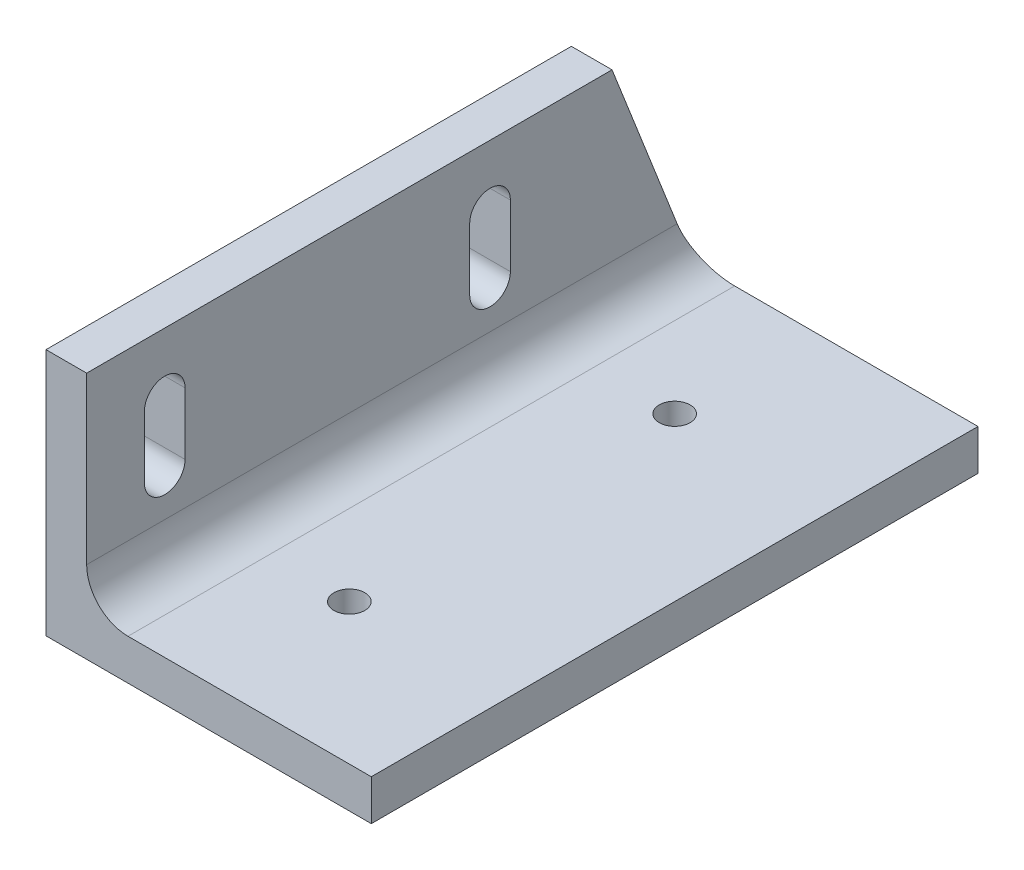
ISO-10303-21;
HEADER;
FILE_DESCRIPTION(('STEP AP214'),'2;1');
FILE_NAME('part.step','',(''),(''),'','','');
FILE_SCHEMA(('AUTOMOTIVE_DESIGN { 1 0 10303 214 1 1 1 1 }'));
ENDSEC;
DATA;
#1=APPLICATION_CONTEXT('core data for automotive mechanical design processes');
#2=APPLICATION_PROTOCOL_DEFINITION('international standard','automotive_design',2000,#1);
#3=PRODUCT_CONTEXT('',#1,'mechanical');
#4=PRODUCT('Part','Part','',(#3));
#5=PRODUCT_RELATED_PRODUCT_CATEGORY('part','',(#4));
#6=PRODUCT_DEFINITION_FORMATION('','',#4);
#7=PRODUCT_DEFINITION_CONTEXT('part definition',#1,'design');
#8=PRODUCT_DEFINITION('design','',#6,#7);
#9=PRODUCT_DEFINITION_SHAPE('','',#8);
#10=(LENGTH_UNIT() NAMED_UNIT(*) SI_UNIT(.MILLI.,.METRE.));
#11=(NAMED_UNIT(*) PLANE_ANGLE_UNIT() SI_UNIT($,.RADIAN.));
#12=(NAMED_UNIT(*) SI_UNIT($,.STERADIAN.) SOLID_ANGLE_UNIT());
#13=UNCERTAINTY_MEASURE_WITH_UNIT(LENGTH_MEASURE(1.E-05),#10,'distance_accuracy_value','');
#14=(GEOMETRIC_REPRESENTATION_CONTEXT(3) GLOBAL_UNCERTAINTY_ASSIGNED_CONTEXT((#13)) GLOBAL_UNIT_ASSIGNED_CONTEXT((#10,
#11,#12)) REPRESENTATION_CONTEXT('',''));
#15=CARTESIAN_POINT('',(0.,0.,0.));
#16=DIRECTION('',(0.,0.,1.));
#17=DIRECTION('',(1.,0.,0.));
#18=AXIS2_PLACEMENT_3D('',#15,#16,#17);
#19=CARTESIAN_POINT('',(-5.,25.48,74.6));
#20=DIRECTION('',(0.,-1.,0.));
#21=DIRECTION('',(0.,0.,-1.));
#22=AXIS2_PLACEMENT_3D('',#19,#20,#21);
#23=PLANE('',#22);
#24=DIRECTION('',(1.,0.,0.));
#25=VECTOR('',#24,1.);
#26=CARTESIAN_POINT('',(-10.,25.48,10.));
#27=LINE('',#26,#25);
#28=CARTESIAN_POINT('',(-5.,25.48,10.));
#29=VERTEX_POINT('',#28);
#30=CARTESIAN_POINT('',(0.,25.48,10.));
#31=VERTEX_POINT('',#30);
#32=EDGE_CURVE('E161',#29,#31,#27,.T.);
#33=ORIENTED_EDGE('',*,*,#32,.F.);
#34=DIRECTION('',(0.,0.,-1.));
#35=VECTOR('',#34,1.);
#36=CARTESIAN_POINT('',(-5.,25.48,74.6));
#37=LINE('',#36,#35);
#38=CARTESIAN_POINT('',(-5.,25.48,74.6));
#39=VERTEX_POINT('',#38);
#40=EDGE_CURVE('E191',#39,#29,#37,.T.);
#41=ORIENTED_EDGE('',*,*,#40,.F.);
#42=DIRECTION('',(-1.,0.,0.));
#43=VECTOR('',#42,1.);
#44=CARTESIAN_POINT('',(-5.,25.48,74.6));
#45=LINE('',#44,#43);
#46=CARTESIAN_POINT('',(0.,25.48,74.6));
#47=VERTEX_POINT('',#46);
#48=EDGE_CURVE('E173',#47,#39,#45,.T.);
#49=ORIENTED_EDGE('',*,*,#48,.F.);
#50=DIRECTION('',(0.,0.,-1.));
#51=VECTOR('',#50,1.);
#52=CARTESIAN_POINT('',(0.,25.48,74.6));
#53=LINE('',#52,#51);
#54=EDGE_CURVE('E155',#47,#31,#53,.T.);
#55=ORIENTED_EDGE('',*,*,#54,.T.);
#56=EDGE_LOOP('',(#33,#41,#49,#55));
#57=FACE_BOUND('',#56,.T.);
#58=ADVANCED_FACE('F38',(#57),#23,.F.);
#59=CARTESIAN_POINT('',(-5.,-5.,74.6));
#60=DIRECTION('',(1.,0.,0.));
#61=DIRECTION('',(0.,0.,-1.));
#62=AXIS2_PLACEMENT_3D('',#59,#60,#61);
#63=PLANE('',#62);
#64=DIRECTION('',(0.,-1.,0.));
#65=VECTOR('',#64,1.);
#66=CARTESIAN_POINT('',(-5.,10.24,67.5000000000004));
#67=LINE('',#66,#65);
#68=CARTESIAN_POINT('',(-5.,17.86,67.5000000000004));
#69=VERTEX_POINT('',#68);
#70=CARTESIAN_POINT('',(-5.,10.24,67.5000000000004));
#71=VERTEX_POINT('',#70);
#72=EDGE_CURVE('E276',#69,#71,#67,.T.);
#73=ORIENTED_EDGE('',*,*,#72,.T.);
#74=CARTESIAN_POINT('',(-5.,10.24,65.0000000000004));
#75=DIRECTION('',(1.,0.,0.));
#76=DIRECTION('',(0.,1.,0.));
#77=AXIS2_PLACEMENT_3D('',#74,#75,#76);
#78=CIRCLE('',#77,2.5);
#79=CARTESIAN_POINT('',(-5.,10.24,62.5000000000004));
#80=VERTEX_POINT('',#79);
#81=EDGE_CURVE('E266',#71,#80,#78,.T.);
#82=ORIENTED_EDGE('',*,*,#81,.T.);
#83=DIRECTION('',(0.,1.,0.));
#84=VECTOR('',#83,1.);
#85=CARTESIAN_POINT('',(-5.,10.24,62.5000000000004));
#86=LINE('',#85,#84);
#87=CARTESIAN_POINT('',(-5.,17.86,62.5000000000004));
#88=VERTEX_POINT('',#87);
#89=EDGE_CURVE('E269',#80,#88,#86,.T.);
#90=ORIENTED_EDGE('',*,*,#89,.T.);
#91=CARTESIAN_POINT('',(-5.,17.86,65.0000000000004));
#92=DIRECTION('',(1.,0.,0.));
#93=DIRECTION('',(0.,1.,0.));
#94=AXIS2_PLACEMENT_3D('',#91,#92,#93);
#95=CIRCLE('',#94,2.5);
#96=EDGE_CURVE('E273',#88,#69,#95,.T.);
#97=ORIENTED_EDGE('',*,*,#96,.T.);
#98=EDGE_LOOP('',(#73,#82,#90,#97));
#99=FACE_BOUND('',#98,.T.);
#100=DIRECTION('',(0.,-1.,0.));
#101=VECTOR('',#100,1.);
#102=CARTESIAN_POINT('',(-5.,10.24,27.5));
#103=LINE('',#102,#101);
#104=CARTESIAN_POINT('',(-5.,17.86,27.5));
#105=VERTEX_POINT('',#104);
#106=CARTESIAN_POINT('',(-5.,10.24,27.5));
#107=VERTEX_POINT('',#106);
#108=EDGE_CURVE('E246',#105,#107,#103,.T.);
#109=ORIENTED_EDGE('',*,*,#108,.T.);
#110=CARTESIAN_POINT('',(-5.,10.24,25.));
#111=DIRECTION('',(1.,0.,0.));
#112=DIRECTION('',(0.,1.,0.));
#113=AXIS2_PLACEMENT_3D('',#110,#111,#112);
#114=CIRCLE('',#113,2.5);
#115=CARTESIAN_POINT('',(-5.,10.24,22.5));
#116=VERTEX_POINT('',#115);
#117=EDGE_CURVE('E236',#107,#116,#114,.T.);
#118=ORIENTED_EDGE('',*,*,#117,.T.);
#119=DIRECTION('',(0.,1.,0.));
#120=VECTOR('',#119,1.);
#121=CARTESIAN_POINT('',(-5.,10.24,22.5));
#122=LINE('',#121,#120);
#123=CARTESIAN_POINT('',(-5.,17.86,22.5));
#124=VERTEX_POINT('',#123);
#125=EDGE_CURVE('E239',#116,#124,#122,.T.);
#126=ORIENTED_EDGE('',*,*,#125,.T.);
#127=CARTESIAN_POINT('',(-5.,17.86,25.));
#128=DIRECTION('',(1.,0.,0.));
#129=DIRECTION('',(0.,1.,0.));
#130=AXIS2_PLACEMENT_3D('',#127,#128,#129);
#131=CIRCLE('',#130,2.5);
#132=EDGE_CURVE('E243',#124,#105,#131,.T.);
#133=ORIENTED_EDGE('',*,*,#132,.T.);
#134=EDGE_LOOP('',(#109,#118,#126,#133));
#135=FACE_BOUND('',#134,.T.);
#136=DIRECTION('',(0.,0.930875774929929,0.365335861432468));
#137=VECTOR('',#136,1.);
#138=CARTESIAN_POINT('',(-5.,21.0374912710429,8.25647224138261));
#139=LINE('',#138,#137);
#140=CARTESIAN_POINT('',(-5.,0.,0.));
#141=VERTEX_POINT('',#140);
#142=EDGE_CURVE('E167',#141,#29,#139,.T.);
#143=ORIENTED_EDGE('',*,*,#142,.F.);
#144=DIRECTION('',(0.,-1.,0.));
#145=VECTOR('',#144,1.);
#146=CARTESIAN_POINT('',(-5.,-5.,0.));
#147=LINE('',#146,#145);
#148=CARTESIAN_POINT('',(-5.,-5.,0.));
#149=VERTEX_POINT('',#148);
#150=EDGE_CURVE('E207',#141,#149,#147,.T.);
#151=ORIENTED_EDGE('',*,*,#150,.T.);
#152=DIRECTION('',(0.,0.,-1.));
#153=VECTOR('',#152,1.);
#154=CARTESIAN_POINT('',(-5.,-5.,74.6));
#155=LINE('',#154,#153);
#156=CARTESIAN_POINT('',(-5.,-5.,74.6));
#157=VERTEX_POINT('',#156);
#158=EDGE_CURVE('E188',#157,#149,#155,.T.);
#159=ORIENTED_EDGE('',*,*,#158,.F.);
#160=DIRECTION('',(0.,-1.,0.));
#161=VECTOR('',#160,1.);
#162=CARTESIAN_POINT('',(-5.,-5.,74.6));
#163=LINE('',#162,#161);
#164=EDGE_CURVE('E214',#39,#157,#163,.T.);
#165=ORIENTED_EDGE('',*,*,#164,.F.);
#166=ORIENTED_EDGE('',*,*,#40,.T.);
#167=EDGE_LOOP('',(#143,#151,#159,#165,#166));
#168=FACE_BOUND('',#167,.T.);
#169=ADVANCED_FACE('F230',(#99,#135,#168),#63,.F.);
#170=CARTESIAN_POINT('',(0.,25.48,74.6));
#171=DIRECTION('',(-1.,0.,0.));
#172=DIRECTION('',(0.,-1.,0.));
#173=AXIS2_PLACEMENT_3D('',#170,#171,#172);
#174=PLANE('',#173);
#175=DIRECTION('',(0.,1.,0.));
#176=VECTOR('',#175,1.);
#177=CARTESIAN_POINT('',(0.,10.24,62.5000000000004));
#178=LINE('',#177,#176);
#179=CARTESIAN_POINT('',(0.,10.24,62.5000000000004));
#180=VERTEX_POINT('',#179);
#181=CARTESIAN_POINT('',(0.,17.86,62.5000000000004));
#182=VERTEX_POINT('',#181);
#183=EDGE_CURVE('E280',#180,#182,#178,.T.);
#184=ORIENTED_EDGE('',*,*,#183,.F.);
#185=CARTESIAN_POINT('',(0.,10.24,65.0000000000004));
#186=DIRECTION('',(1.,0.,0.));
#187=DIRECTION('',(0.,1.,0.));
#188=AXIS2_PLACEMENT_3D('',#185,#186,#187);
#189=CIRCLE('',#188,2.5);
#190=CARTESIAN_POINT('',(0.,10.24,67.5000000000004));
#191=VERTEX_POINT('',#190);
#192=EDGE_CURVE('E259',#191,#180,#189,.T.);
#193=ORIENTED_EDGE('',*,*,#192,.F.);
#194=DIRECTION('',(0.,-1.,0.));
#195=VECTOR('',#194,1.);
#196=CARTESIAN_POINT('',(0.,10.24,67.5000000000004));
#197=LINE('',#196,#195);
#198=CARTESIAN_POINT('',(0.,17.86,67.5000000000004));
#199=VERTEX_POINT('',#198);
#200=EDGE_CURVE('E270',#199,#191,#197,.T.);
#201=ORIENTED_EDGE('',*,*,#200,.F.);
#202=CARTESIAN_POINT('',(0.,17.86,65.0000000000004));
#203=DIRECTION('',(1.,0.,0.));
#204=DIRECTION('',(0.,1.,0.));
#205=AXIS2_PLACEMENT_3D('',#202,#203,#204);
#206=CIRCLE('',#205,2.5);
#207=EDGE_CURVE('E283',#182,#199,#206,.T.);
#208=ORIENTED_EDGE('',*,*,#207,.F.);
#209=EDGE_LOOP('',(#184,#193,#201,#208));
#210=FACE_BOUND('',#209,.T.);
#211=DIRECTION('',(0.,1.,0.));
#212=VECTOR('',#211,1.);
#213=CARTESIAN_POINT('',(0.,10.24,22.5));
#214=LINE('',#213,#212);
#215=CARTESIAN_POINT('',(0.,10.24,22.5));
#216=VERTEX_POINT('',#215);
#217=CARTESIAN_POINT('',(0.,17.86,22.5));
#218=VERTEX_POINT('',#217);
#219=EDGE_CURVE('E233',#216,#218,#214,.T.);
#220=ORIENTED_EDGE('',*,*,#219,.F.);
#221=CARTESIAN_POINT('',(0.,10.24,25.));
#222=DIRECTION('',(1.,0.,0.));
#223=DIRECTION('',(0.,1.,0.));
#224=AXIS2_PLACEMENT_3D('',#221,#222,#223);
#225=CIRCLE('',#224,2.5);
#226=CARTESIAN_POINT('',(0.,10.24,27.5));
#227=VERTEX_POINT('',#226);
#228=EDGE_CURVE('E231',#227,#216,#225,.T.);
#229=ORIENTED_EDGE('',*,*,#228,.F.);
#230=DIRECTION('',(0.,-1.,0.));
#231=VECTOR('',#230,1.);
#232=CARTESIAN_POINT('',(0.,10.24,27.5));
#233=LINE('',#232,#231);
#234=CARTESIAN_POINT('',(0.,17.86,27.5));
#235=VERTEX_POINT('',#234);
#236=EDGE_CURVE('E240',#235,#227,#233,.T.);
#237=ORIENTED_EDGE('',*,*,#236,.F.);
#238=CARTESIAN_POINT('',(0.,17.86,25.));
#239=DIRECTION('',(1.,0.,0.));
#240=DIRECTION('',(0.,1.,0.));
#241=AXIS2_PLACEMENT_3D('',#238,#239,#240);
#242=CIRCLE('',#241,2.5);
#243=EDGE_CURVE('E252',#218,#235,#242,.T.);
#244=ORIENTED_EDGE('',*,*,#243,.F.);
#245=EDGE_LOOP('',(#220,#229,#237,#244));
#246=FACE_BOUND('',#245,.T.);
#247=DIRECTION('',(0.,1.,0.));
#248=VECTOR('',#247,1.);
#249=CARTESIAN_POINT('',(0.,25.48,74.6));
#250=LINE('',#249,#248);
#251=CARTESIAN_POINT('',(0.,5.08000000000001,74.6));
#252=VERTEX_POINT('',#251);
#253=EDGE_CURVE('E175',#252,#47,#250,.T.);
#254=ORIENTED_EDGE('',*,*,#253,.F.);
#255=DIRECTION('',(0.,0.,-1.));
#256=VECTOR('',#255,1.);
#257=CARTESIAN_POINT('',(0.,5.08,0.));
#258=LINE('',#257,#256);
#259=CARTESIAN_POINT('',(0.,5.08,1.99372056514914));
#260=VERTEX_POINT('',#259);
#261=EDGE_CURVE('E158',#252,#260,#258,.T.);
#262=ORIENTED_EDGE('',*,*,#261,.T.);
#263=DIRECTION('',(0.,0.930875774929929,0.365335861432468));
#264=VECTOR('',#263,1.);
#265=CARTESIAN_POINT('',(0.,0.,0.));
#266=LINE('',#265,#264);
#267=EDGE_CURVE('E150',#260,#31,#266,.T.);
#268=ORIENTED_EDGE('',*,*,#267,.T.);
#269=ORIENTED_EDGE('',*,*,#54,.F.);
#270=EDGE_LOOP('',(#254,#262,#268,#269));
#271=FACE_BOUND('',#270,.T.);
#272=ADVANCED_FACE('F153',(#210,#246,#271),#174,.F.);
#273=CARTESIAN_POINT('',(0.,0.,0.));
#274=DIRECTION('',(0.,0.,-1.));
#275=DIRECTION('',(-1.,0.,0.));
#276=AXIS2_PLACEMENT_3D('',#273,#274,#275);
#277=PLANE('',#276);
#278=ORIENTED_EDGE('',*,*,#150,.F.);
#279=DIRECTION('',(1.,0.,0.));
#280=VECTOR('',#279,1.);
#281=CARTESIAN_POINT('',(0.,0.,0.));
#282=LINE('',#281,#280);
#283=CARTESIAN_POINT('',(5.08,0.,0.));
#284=VERTEX_POINT('',#283);
#285=EDGE_CURVE('E53',#141,#284,#282,.T.);
#286=ORIENTED_EDGE('',*,*,#285,.T.);
#287=DIRECTION('',(-1.,0.,0.));
#288=VECTOR('',#287,1.);
#289=CARTESIAN_POINT('',(0.,0.,0.));
#290=LINE('',#289,#288);
#291=CARTESIAN_POINT('',(35.,0.,0.));
#292=VERTEX_POINT('',#291);
#293=EDGE_CURVE('E183',#292,#284,#290,.T.);
#294=ORIENTED_EDGE('',*,*,#293,.F.);
#295=DIRECTION('',(0.,1.,0.));
#296=VECTOR('',#295,1.);
#297=CARTESIAN_POINT('',(35.,0.,0.));
#298=LINE('',#297,#296);
#299=CARTESIAN_POINT('',(35.,-4.99999999999999,0.));
#300=VERTEX_POINT('',#299);
#301=EDGE_CURVE('E211',#300,#292,#298,.T.);
#302=ORIENTED_EDGE('',*,*,#301,.F.);
#303=DIRECTION('',(1.,0.,0.));
#304=VECTOR('',#303,1.);
#305=CARTESIAN_POINT('',(35.,-4.99999999999999,0.));
#306=LINE('',#305,#304);
#307=EDGE_CURVE('E209',#149,#300,#306,.T.);
#308=ORIENTED_EDGE('',*,*,#307,.F.);
#309=EDGE_LOOP('',(#278,#286,#294,#302,#308));
#310=FACE_BOUND('',#309,.T.);
#311=ADVANCED_FACE('F228',(#310),#277,.T.);
#312=CARTESIAN_POINT('',(35.,-4.99999999999999,74.6));
#313=DIRECTION('',(0.,1.,0.));
#314=DIRECTION('',(-1.,0.,0.));
#315=AXIS2_PLACEMENT_3D('',#312,#313,#314);
#316=PLANE('',#315);
#317=CARTESIAN_POINT('',(15.,-5.,17.3));
#318=DIRECTION('',(0.,1.,0.));
#319=DIRECTION('',(0.,0.,1.));
#320=AXIS2_PLACEMENT_3D('',#317,#318,#319);
#321=CIRCLE('',#320,1.89865);
#322=CARTESIAN_POINT('',(15.,-5.,19.19865));
#323=VERTEX_POINT('',#322);
#324=EDGE_CURVE('E493',#323,#323,#321,.T.);
#325=ORIENTED_EDGE('',*,*,#324,.T.);
#326=EDGE_LOOP('',(#325));
#327=FACE_BOUND('',#326,.T.);
#328=CARTESIAN_POINT('',(15.,-5.,57.3));
#329=DIRECTION('',(0.,1.,0.));
#330=DIRECTION('',(0.,0.,1.));
#331=AXIS2_PLACEMENT_3D('',#328,#329,#330);
#332=CIRCLE('',#331,1.89865);
#333=CARTESIAN_POINT('',(15.,-5.,59.19865));
#334=VERTEX_POINT('',#333);
#335=EDGE_CURVE('E162',#334,#334,#332,.T.);
#336=ORIENTED_EDGE('',*,*,#335,.T.);
#337=EDGE_LOOP('',(#336));
#338=FACE_BOUND('',#337,.T.);
#339=ORIENTED_EDGE('',*,*,#307,.T.);
#340=DIRECTION('',(0.,0.,-1.));
#341=VECTOR('',#340,1.);
#342=CARTESIAN_POINT('',(35.,-4.99999999999999,74.6));
#343=LINE('',#342,#341);
#344=CARTESIAN_POINT('',(35.,-4.99999999999999,74.6));
#345=VERTEX_POINT('',#344);
#346=EDGE_CURVE('E178',#345,#300,#343,.T.);
#347=ORIENTED_EDGE('',*,*,#346,.F.);
#348=DIRECTION('',(1.,0.,0.));
#349=VECTOR('',#348,1.);
#350=CARTESIAN_POINT('',(35.,-4.99999999999999,74.6));
#351=LINE('',#350,#349);
#352=EDGE_CURVE('E203',#157,#345,#351,.T.);
#353=ORIENTED_EDGE('',*,*,#352,.F.);
#354=ORIENTED_EDGE('',*,*,#158,.T.);
#355=EDGE_LOOP('',(#339,#347,#353,#354));
#356=FACE_BOUND('',#355,.T.);
#357=ADVANCED_FACE('F224',(#327,#338,#356),#316,.F.);
#358=CARTESIAN_POINT('',(35.,0.,74.6));
#359=DIRECTION('',(-1.,0.,0.));
#360=DIRECTION('',(0.,0.,1.));
#361=AXIS2_PLACEMENT_3D('',#358,#359,#360);
#362=PLANE('',#361);
#363=ORIENTED_EDGE('',*,*,#301,.T.);
#364=DIRECTION('',(0.,0.,-1.));
#365=VECTOR('',#364,1.);
#366=CARTESIAN_POINT('',(35.,0.,74.6));
#367=LINE('',#366,#365);
#368=CARTESIAN_POINT('',(35.,0.,74.6));
#369=VERTEX_POINT('',#368);
#370=EDGE_CURVE('E174',#369,#292,#367,.T.);
#371=ORIENTED_EDGE('',*,*,#370,.F.);
#372=DIRECTION('',(0.,1.,0.));
#373=VECTOR('',#372,1.);
#374=CARTESIAN_POINT('',(35.,0.,74.6));
#375=LINE('',#374,#373);
#376=EDGE_CURVE('E200',#345,#369,#375,.T.);
#377=ORIENTED_EDGE('',*,*,#376,.F.);
#378=ORIENTED_EDGE('',*,*,#346,.T.);
#379=EDGE_LOOP('',(#363,#371,#377,#378));
#380=FACE_BOUND('',#379,.T.);
#381=ADVANCED_FACE('F226',(#380),#362,.F.);
#382=CARTESIAN_POINT('',(0.,0.,74.6));
#383=DIRECTION('',(0.,-1.,0.));
#384=DIRECTION('',(0.,0.,-1.));
#385=AXIS2_PLACEMENT_3D('',#382,#383,#384);
#386=PLANE('',#385);
#387=CARTESIAN_POINT('',(15.,0.,17.3));
#388=DIRECTION('',(0.,1.,0.));
#389=DIRECTION('',(0.,0.,1.));
#390=AXIS2_PLACEMENT_3D('',#387,#388,#389);
#391=CIRCLE('',#390,1.89864999999999);
#392=CARTESIAN_POINT('',(15.,0.,19.19865));
#393=VERTEX_POINT('',#392);
#394=EDGE_CURVE('E496',#393,#393,#391,.T.);
#395=ORIENTED_EDGE('',*,*,#394,.F.);
#396=EDGE_LOOP('',(#395));
#397=FACE_BOUND('',#396,.T.);
#398=CARTESIAN_POINT('',(15.,0.,57.3));
#399=DIRECTION('',(0.,1.,0.));
#400=DIRECTION('',(0.,0.,1.));
#401=AXIS2_PLACEMENT_3D('',#398,#399,#400);
#402=CIRCLE('',#401,1.89864999999999);
#403=CARTESIAN_POINT('',(15.,0.,59.19865));
#404=VERTEX_POINT('',#403);
#405=EDGE_CURVE('E498',#404,#404,#402,.T.);
#406=ORIENTED_EDGE('',*,*,#405,.F.);
#407=EDGE_LOOP('',(#406));
#408=FACE_BOUND('',#407,.T.);
#409=ORIENTED_EDGE('',*,*,#293,.T.);
#410=DIRECTION('',(0.,0.,-1.));
#411=VECTOR('',#410,1.);
#412=CARTESIAN_POINT('',(5.08,0.,74.6));
#413=LINE('',#412,#411);
#414=CARTESIAN_POINT('',(5.08,0.,74.6));
#415=VERTEX_POINT('',#414);
#416=EDGE_CURVE('E60',#284,#415,#413,.F.);
#417=ORIENTED_EDGE('',*,*,#416,.T.);
#418=DIRECTION('',(-1.,0.,0.));
#419=VECTOR('',#418,1.);
#420=CARTESIAN_POINT('',(0.,0.,74.6));
#421=LINE('',#420,#419);
#422=EDGE_CURVE('E180',#369,#415,#421,.T.);
#423=ORIENTED_EDGE('',*,*,#422,.F.);
#424=ORIENTED_EDGE('',*,*,#370,.T.);
#425=EDGE_LOOP('',(#409,#417,#423,#424));
#426=FACE_BOUND('',#425,.T.);
#427=ADVANCED_FACE('F227',(#397,#408,#426),#386,.F.);
#428=CARTESIAN_POINT('',(0.,0.,74.6));
#429=DIRECTION('',(0.,0.,-1.));
#430=DIRECTION('',(-1.,0.,0.));
#431=AXIS2_PLACEMENT_3D('',#428,#429,#430);
#432=PLANE('',#431);
#433=ORIENTED_EDGE('',*,*,#48,.T.);
#434=ORIENTED_EDGE('',*,*,#164,.T.);
#435=ORIENTED_EDGE('',*,*,#352,.T.);
#436=ORIENTED_EDGE('',*,*,#376,.T.);
#437=ORIENTED_EDGE('',*,*,#422,.T.);
#438=CARTESIAN_POINT('',(5.08,5.08,74.6));
#439=DIRECTION('',(0.,0.,-1.));
#440=DIRECTION('',(-1.,0.,0.));
#441=AXIS2_PLACEMENT_3D('',#438,#439,#440);
#442=CIRCLE('',#441,5.08);
#443=EDGE_CURVE('E11',#415,#252,#442,.T.);
#444=ORIENTED_EDGE('',*,*,#443,.T.);
#445=ORIENTED_EDGE('',*,*,#253,.T.);
#446=EDGE_LOOP('',(#433,#434,#435,#436,#437,#444,#445));
#447=FACE_BOUND('',#446,.T.);
#448=ADVANCED_FACE('F198',(#447),#432,.F.);
#449=CARTESIAN_POINT('',(-5.,10.24,65.0000000000004));
#450=DIRECTION('',(1.,0.,0.));
#451=DIRECTION('',(0.,1.,0.));
#452=AXIS2_PLACEMENT_3D('',#449,#450,#451);
#453=CYLINDRICAL_SURFACE('',#452,2.5);
#454=ORIENTED_EDGE('',*,*,#192,.T.);
#455=DIRECTION('',(1.,0.,0.));
#456=VECTOR('',#455,1.);
#457=CARTESIAN_POINT('',(-5.,10.24,62.5000000000004));
#458=LINE('',#457,#456);
#459=EDGE_CURVE('E218',#80,#180,#458,.T.);
#460=ORIENTED_EDGE('',*,*,#459,.F.);
#461=ORIENTED_EDGE('',*,*,#81,.F.);
#462=DIRECTION('',(1.,0.,0.));
#463=VECTOR('',#462,1.);
#464=CARTESIAN_POINT('',(-5.,10.24,67.5000000000004));
#465=LINE('',#464,#463);
#466=EDGE_CURVE('E210',#71,#191,#465,.T.);
#467=ORIENTED_EDGE('',*,*,#466,.T.);
#468=EDGE_LOOP('',(#454,#460,#461,#467));
#469=FACE_BOUND('',#468,.T.);
#470=ADVANCED_FACE('F311',(#469),#453,.F.);
#471=CARTESIAN_POINT('',(-5.,10.24,67.5000000000004));
#472=DIRECTION('',(0.,0.,1.));
#473=DIRECTION('',(1.,0.,0.));
#474=AXIS2_PLACEMENT_3D('',#471,#472,#473);
#475=PLANE('',#474);
#476=ORIENTED_EDGE('',*,*,#200,.T.);
#477=ORIENTED_EDGE('',*,*,#466,.F.);
#478=ORIENTED_EDGE('',*,*,#72,.F.);
#479=DIRECTION('',(1.,0.,0.));
#480=VECTOR('',#479,1.);
#481=CARTESIAN_POINT('',(-5.,17.86,67.5000000000004));
#482=LINE('',#481,#480);
#483=EDGE_CURVE('E289',#69,#199,#482,.T.);
#484=ORIENTED_EDGE('',*,*,#483,.T.);
#485=EDGE_LOOP('',(#476,#477,#478,#484));
#486=FACE_BOUND('',#485,.T.);
#487=ADVANCED_FACE('F308',(#486),#475,.F.);
#488=CARTESIAN_POINT('',(-5.,17.86,65.0000000000004));
#489=DIRECTION('',(1.,0.,0.));
#490=DIRECTION('',(0.,1.,0.));
#491=AXIS2_PLACEMENT_3D('',#488,#489,#490);
#492=CYLINDRICAL_SURFACE('',#491,2.5);
#493=ORIENTED_EDGE('',*,*,#207,.T.);
#494=ORIENTED_EDGE('',*,*,#483,.F.);
#495=ORIENTED_EDGE('',*,*,#96,.F.);
#496=DIRECTION('',(1.,0.,0.));
#497=VECTOR('',#496,1.);
#498=CARTESIAN_POINT('',(-5.,17.86,62.5000000000004));
#499=LINE('',#498,#497);
#500=EDGE_CURVE('E290',#88,#182,#499,.T.);
#501=ORIENTED_EDGE('',*,*,#500,.T.);
#502=EDGE_LOOP('',(#493,#494,#495,#501));
#503=FACE_BOUND('',#502,.T.);
#504=ADVANCED_FACE('F305',(#503),#492,.F.);
#505=CARTESIAN_POINT('',(-5.,10.24,62.5000000000004));
#506=DIRECTION('',(0.,0.,-1.));
#507=DIRECTION('',(-1.,0.,0.));
#508=AXIS2_PLACEMENT_3D('',#505,#506,#507);
#509=PLANE('',#508);
#510=ORIENTED_EDGE('',*,*,#183,.T.);
#511=ORIENTED_EDGE('',*,*,#500,.F.);
#512=ORIENTED_EDGE('',*,*,#89,.F.);
#513=ORIENTED_EDGE('',*,*,#459,.T.);
#514=EDGE_LOOP('',(#510,#511,#512,#513));
#515=FACE_BOUND('',#514,.T.);
#516=ADVANCED_FACE('F297',(#515),#509,.F.);
#517=CARTESIAN_POINT('',(-5.,10.24,25.));
#518=DIRECTION('',(1.,0.,0.));
#519=DIRECTION('',(0.,1.,0.));
#520=AXIS2_PLACEMENT_3D('',#517,#518,#519);
#521=CYLINDRICAL_SURFACE('',#520,2.5);
#522=ORIENTED_EDGE('',*,*,#228,.T.);
#523=DIRECTION('',(1.,0.,0.));
#524=VECTOR('',#523,1.);
#525=CARTESIAN_POINT('',(-5.,10.24,22.5));
#526=LINE('',#525,#524);
#527=EDGE_CURVE('E248',#116,#216,#526,.T.);
#528=ORIENTED_EDGE('',*,*,#527,.F.);
#529=ORIENTED_EDGE('',*,*,#117,.F.);
#530=DIRECTION('',(1.,0.,0.));
#531=VECTOR('',#530,1.);
#532=CARTESIAN_POINT('',(-5.,10.24,27.5));
#533=LINE('',#532,#531);
#534=EDGE_CURVE('E257',#107,#227,#533,.T.);
#535=ORIENTED_EDGE('',*,*,#534,.T.);
#536=EDGE_LOOP('',(#522,#528,#529,#535));
#537=FACE_BOUND('',#536,.T.);
#538=ADVANCED_FACE('F412',(#537),#521,.F.);
#539=CARTESIAN_POINT('',(-5.,10.24,27.5));
#540=DIRECTION('',(0.,0.,1.));
#541=DIRECTION('',(1.,0.,0.));
#542=AXIS2_PLACEMENT_3D('',#539,#540,#541);
#543=PLANE('',#542);
#544=ORIENTED_EDGE('',*,*,#236,.T.);
#545=ORIENTED_EDGE('',*,*,#534,.F.);
#546=ORIENTED_EDGE('',*,*,#108,.F.);
#547=DIRECTION('',(1.,0.,0.));
#548=VECTOR('',#547,1.);
#549=CARTESIAN_POINT('',(-5.,17.86,27.5));
#550=LINE('',#549,#548);
#551=EDGE_CURVE('E260',#105,#235,#550,.T.);
#552=ORIENTED_EDGE('',*,*,#551,.T.);
#553=EDGE_LOOP('',(#544,#545,#546,#552));
#554=FACE_BOUND('',#553,.T.);
#555=ADVANCED_FACE('F408',(#554),#543,.F.);
#556=CARTESIAN_POINT('',(-5.,17.86,25.));
#557=DIRECTION('',(1.,0.,0.));
#558=DIRECTION('',(0.,1.,0.));
#559=AXIS2_PLACEMENT_3D('',#556,#557,#558);
#560=CYLINDRICAL_SURFACE('',#559,2.5);
#561=ORIENTED_EDGE('',*,*,#243,.T.);
#562=ORIENTED_EDGE('',*,*,#551,.F.);
#563=ORIENTED_EDGE('',*,*,#132,.F.);
#564=DIRECTION('',(1.,0.,0.));
#565=VECTOR('',#564,1.);
#566=CARTESIAN_POINT('',(-5.,17.86,22.5));
#567=LINE('',#566,#565);
#568=EDGE_CURVE('E262',#124,#218,#567,.T.);
#569=ORIENTED_EDGE('',*,*,#568,.T.);
#570=EDGE_LOOP('',(#561,#562,#563,#569));
#571=FACE_BOUND('',#570,.T.);
#572=ADVANCED_FACE('F411',(#571),#560,.F.);
#573=CARTESIAN_POINT('',(-5.,10.24,22.5));
#574=DIRECTION('',(0.,0.,-1.));
#575=DIRECTION('',(-1.,0.,0.));
#576=AXIS2_PLACEMENT_3D('',#573,#574,#575);
#577=PLANE('',#576);
#578=ORIENTED_EDGE('',*,*,#219,.T.);
#579=ORIENTED_EDGE('',*,*,#568,.F.);
#580=ORIENTED_EDGE('',*,*,#125,.F.);
#581=ORIENTED_EDGE('',*,*,#527,.T.);
#582=EDGE_LOOP('',(#578,#579,#580,#581));
#583=FACE_BOUND('',#582,.T.);
#584=ADVANCED_FACE('F369',(#583),#577,.F.);
#585=CARTESIAN_POINT('',(-10.,0.,0.));
#586=DIRECTION('',(0.,0.365335861432468,-0.930875774929929));
#587=DIRECTION('',(0.,0.930875774929929,0.365335861432468));
#588=AXIS2_PLACEMENT_3D('',#585,#586,#587);
#589=PLANE('',#588);
#590=ORIENTED_EDGE('',*,*,#142,.T.);
#591=ORIENTED_EDGE('',*,*,#32,.T.);
#592=ORIENTED_EDGE('',*,*,#267,.F.);
#593=CARTESIAN_POINT('',(5.08,5.08,1.99372056514913));
#594=DIRECTION('',(0.,0.365335861432468,-0.930875774929929));
#595=DIRECTION('',(0.,0.930875774929929,0.365335861432468));
#596=AXIS2_PLACEMENT_3D('',#593,#594,#595);
#597=ELLIPSE('',#596,5.45722655676843,5.08);
#598=EDGE_CURVE('E46',#260,#284,#597,.F.);
#599=ORIENTED_EDGE('',*,*,#598,.T.);
#600=ORIENTED_EDGE('',*,*,#285,.F.);
#601=EDGE_LOOP('',(#590,#591,#592,#599,#600));
#602=FACE_BOUND('',#601,.T.);
#603=ADVANCED_FACE('F165',(#602),#589,.T.);
#604=CARTESIAN_POINT('',(5.08,5.08,74.6));
#605=DIRECTION('',(0.,0.,1.));
#606=DIRECTION('',(1.,0.,0.));
#607=AXIS2_PLACEMENT_3D('',#604,#605,#606);
#608=CYLINDRICAL_SURFACE('',#607,5.08);
#609=ORIENTED_EDGE('',*,*,#443,.F.);
#610=ORIENTED_EDGE('',*,*,#416,.F.);
#611=ORIENTED_EDGE('',*,*,#598,.F.);
#612=ORIENTED_EDGE('',*,*,#261,.F.);
#613=EDGE_LOOP('',(#609,#610,#611,#612));
#614=FACE_BOUND('',#613,.T.);
#615=ADVANCED_FACE('F40',(#614),#608,.F.);
#616=CARTESIAN_POINT('',(15.,0.,57.3));
#617=DIRECTION('',(0.,1.,0.));
#618=DIRECTION('',(0.,0.,1.));
#619=AXIS2_PLACEMENT_3D('',#616,#617,#618);
#620=CYLINDRICAL_SURFACE('',#619,1.89864999999999);
#621=ORIENTED_EDGE('',*,*,#335,.F.);
#622=EDGE_LOOP('',(#621));
#623=FACE_BOUND('',#622,.T.);
#624=ORIENTED_EDGE('',*,*,#405,.T.);
#625=EDGE_LOOP('',(#624));
#626=FACE_BOUND('',#625,.T.);
#627=ADVANCED_FACE('F379',(#623,#626),#620,.F.);
#628=CARTESIAN_POINT('',(15.,0.,17.3));
#629=DIRECTION('',(0.,1.,0.));
#630=DIRECTION('',(0.,0.,1.));
#631=AXIS2_PLACEMENT_3D('',#628,#629,#630);
#632=CYLINDRICAL_SURFACE('',#631,1.89864999999999);
#633=ORIENTED_EDGE('',*,*,#324,.F.);
#634=EDGE_LOOP('',(#633));
#635=FACE_BOUND('',#634,.T.);
#636=ORIENTED_EDGE('',*,*,#394,.T.);
#637=EDGE_LOOP('',(#636));
#638=FACE_BOUND('',#637,.T.);
#639=ADVANCED_FACE('F388',(#635,#638),#632,.F.);
#640=CLOSED_SHELL('',(#58,#169,#272,#311,#357,#381,#427,#448,#470,#487,#504,#516,#538,#555,#572,
#584,#603,#615,#627,#639));
#641=MANIFOLD_SOLID_BREP('B2',#640);
#642=ADVANCED_BREP_SHAPE_REPRESENTATION('',(#18,#641),#14);
#643=SHAPE_DEFINITION_REPRESENTATION(#9,#642);
ENDSEC;
END-ISO-10303-21;
